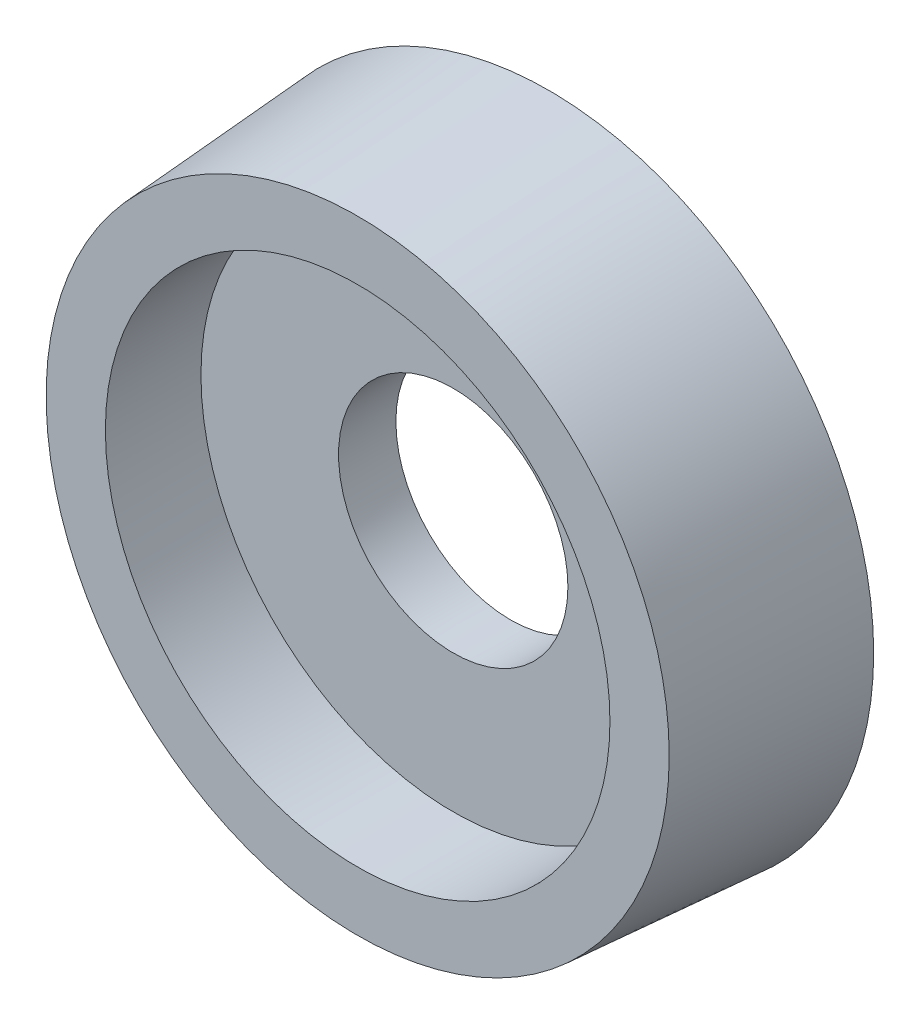
ISO-10303-21;
HEADER;
FILE_DESCRIPTION(('STEP AP214'),'2;1');
FILE_NAME('part.step','',(''),(''),'','','');
FILE_SCHEMA(('AUTOMOTIVE_DESIGN { 1 0 10303 214 1 1 1 1 }'));
ENDSEC;
DATA;
#1=APPLICATION_CONTEXT('core data for automotive mechanical design processes');
#2=APPLICATION_PROTOCOL_DEFINITION('international standard','automotive_design',2000,#1);
#3=PRODUCT_CONTEXT('',#1,'mechanical');
#4=PRODUCT('Part','Part','',(#3));
#5=PRODUCT_RELATED_PRODUCT_CATEGORY('part','',(#4));
#6=PRODUCT_DEFINITION_FORMATION('','',#4);
#7=PRODUCT_DEFINITION_CONTEXT('part definition',#1,'design');
#8=PRODUCT_DEFINITION('design','',#6,#7);
#9=PRODUCT_DEFINITION_SHAPE('','',#8);
#10=(LENGTH_UNIT() NAMED_UNIT(*) SI_UNIT(.MILLI.,.METRE.));
#11=(NAMED_UNIT(*) PLANE_ANGLE_UNIT() SI_UNIT($,.RADIAN.));
#12=(NAMED_UNIT(*) SI_UNIT($,.STERADIAN.) SOLID_ANGLE_UNIT());
#13=UNCERTAINTY_MEASURE_WITH_UNIT(LENGTH_MEASURE(1.E-05),#10,'distance_accuracy_value','');
#14=(GEOMETRIC_REPRESENTATION_CONTEXT(3) GLOBAL_UNCERTAINTY_ASSIGNED_CONTEXT((#13)) GLOBAL_UNIT_ASSIGNED_CONTEXT((#10,
#11,#12)) REPRESENTATION_CONTEXT('',''));
#15=CARTESIAN_POINT('',(0.,0.,0.));
#16=DIRECTION('',(0.,0.,1.));
#17=DIRECTION('',(1.,0.,0.));
#18=AXIS2_PLACEMENT_3D('',#15,#16,#17);
#19=CARTESIAN_POINT('',(0.,0.,0.));
#20=DIRECTION('',(0.,0.,-1.));
#21=DIRECTION('',(1.,0.,0.));
#22=AXIS2_PLACEMENT_3D('',#19,#20,#21);
#23=CONICAL_SURFACE('',#22,8.5,0.0698131700797732);
#24=CARTESIAN_POINT('',(0.,0.,5.));
#25=DIRECTION('',(0.,0.,1.));
#26=DIRECTION('',(1.,0.,0.));
#27=AXIS2_PLACEMENT_3D('',#24,#25,#26);
#28=CIRCLE('',#27,8.15036594028245);
#29=CARTESIAN_POINT('',(8.15036594028245,0.,5.));
#30=VERTEX_POINT('',#29);
#31=EDGE_CURVE('E10',#30,#30,#28,.T.);
#32=ORIENTED_EDGE('',*,*,#31,.F.);
#33=EDGE_LOOP('',(#32));
#34=FACE_BOUND('',#33,.T.);
#35=CARTESIAN_POINT('',(0.,0.,0.));
#36=DIRECTION('',(0.,0.,1.));
#37=DIRECTION('',(1.,0.,0.));
#38=AXIS2_PLACEMENT_3D('',#35,#36,#37);
#39=CIRCLE('',#38,8.5);
#40=CARTESIAN_POINT('',(8.5,0.,0.));
#41=VERTEX_POINT('',#40);
#42=EDGE_CURVE('E45',#41,#41,#39,.T.);
#43=ORIENTED_EDGE('',*,*,#42,.T.);
#44=EDGE_LOOP('',(#43));
#45=FACE_BOUND('',#44,.T.);
#46=ADVANCED_FACE('F37',(#34,#45),#23,.T.);
#47=CARTESIAN_POINT('',(0.,0.,5.));
#48=DIRECTION('',(0.,0.,1.));
#49=DIRECTION('',(1.,0.,0.));
#50=AXIS2_PLACEMENT_3D('',#47,#48,#49);
#51=PLANE('',#50);
#52=CARTESIAN_POINT('',(0.,0.,5.));
#53=DIRECTION('',(0.,0.,1.));
#54=DIRECTION('',(1.,0.,0.));
#55=AXIS2_PLACEMENT_3D('',#52,#53,#54);
#56=CIRCLE('',#55,6.6);
#57=CARTESIAN_POINT('',(6.6,0.,5.));
#58=VERTEX_POINT('',#57);
#59=EDGE_CURVE('E61',#58,#58,#56,.T.);
#60=ORIENTED_EDGE('',*,*,#59,.F.);
#61=EDGE_LOOP('',(#60));
#62=FACE_BOUND('',#61,.T.);
#63=ORIENTED_EDGE('',*,*,#31,.T.);
#64=EDGE_LOOP('',(#63));
#65=FACE_BOUND('',#64,.T.);
#66=ADVANCED_FACE('F92',(#62,#65),#51,.T.);
#67=CARTESIAN_POINT('',(0.,0.,0.));
#68=DIRECTION('',(0.,0.,1.));
#69=DIRECTION('',(1.,0.,0.));
#70=AXIS2_PLACEMENT_3D('',#67,#68,#69);
#71=PLANE('',#70);
#72=CARTESIAN_POINT('',(0.,0.,0.));
#73=DIRECTION('',(0.,0.,-1.));
#74=DIRECTION('',(-1.,0.,0.));
#75=AXIS2_PLACEMENT_3D('',#72,#73,#74);
#76=CIRCLE('',#75,5.);
#77=CARTESIAN_POINT('',(-5.,0.,0.));
#78=VERTEX_POINT('',#77);
#79=EDGE_CURVE('E53',#78,#78,#76,.T.);
#80=ORIENTED_EDGE('',*,*,#79,.F.);
#81=EDGE_LOOP('',(#80));
#82=FACE_BOUND('',#81,.T.);
#83=ORIENTED_EDGE('',*,*,#42,.F.);
#84=EDGE_LOOP('',(#83));
#85=FACE_BOUND('',#84,.T.);
#86=ADVANCED_FACE('F94',(#82,#85),#71,.F.);
#87=CARTESIAN_POINT('',(0.,0.,1.));
#88=DIRECTION('',(0.,0.,-1.));
#89=DIRECTION('',(-1.,0.,0.));
#90=AXIS2_PLACEMENT_3D('',#87,#88,#89);
#91=CYLINDRICAL_SURFACE('',#90,5.);
#92=CARTESIAN_POINT('',(0.,0.,1.));
#93=DIRECTION('',(0.,0.,-1.));
#94=DIRECTION('',(-1.,0.,0.));
#95=AXIS2_PLACEMENT_3D('',#92,#93,#94);
#96=CIRCLE('',#95,5.);
#97=CARTESIAN_POINT('',(-5.,0.,1.));
#98=VERTEX_POINT('',#97);
#99=EDGE_CURVE('E50',#98,#98,#96,.T.);
#100=ORIENTED_EDGE('',*,*,#99,.F.);
#101=EDGE_LOOP('',(#100));
#102=FACE_BOUND('',#101,.T.);
#103=ORIENTED_EDGE('',*,*,#79,.T.);
#104=EDGE_LOOP('',(#103));
#105=FACE_BOUND('',#104,.T.);
#106=ADVANCED_FACE('F100',(#102,#105),#91,.F.);
#107=CARTESIAN_POINT('',(0.,0.,1.));
#108=DIRECTION('',(0.,0.,-1.));
#109=DIRECTION('',(-1.,0.,0.));
#110=AXIS2_PLACEMENT_3D('',#107,#108,#109);
#111=PLANE('',#110);
#112=CARTESIAN_POINT('',(0.,0.,1.));
#113=DIRECTION('',(0.,0.,-1.));
#114=DIRECTION('',(-1.,0.,0.));
#115=AXIS2_PLACEMENT_3D('',#112,#113,#114);
#116=CIRCLE('',#115,3.);
#117=CARTESIAN_POINT('',(-3.,0.,1.));
#118=VERTEX_POINT('',#117);
#119=EDGE_CURVE('E65',#118,#118,#116,.T.);
#120=ORIENTED_EDGE('',*,*,#119,.F.);
#121=EDGE_LOOP('',(#120));
#122=FACE_BOUND('',#121,.T.);
#123=ORIENTED_EDGE('',*,*,#99,.T.);
#124=EDGE_LOOP('',(#123));
#125=FACE_BOUND('',#124,.T.);
#126=ADVANCED_FACE('F88',(#122,#125),#111,.T.);
#127=CARTESIAN_POINT('',(0.,0.,2.5));
#128=DIRECTION('',(0.,0.,1.));
#129=DIRECTION('',(1.,0.,0.));
#130=AXIS2_PLACEMENT_3D('',#127,#128,#129);
#131=CYLINDRICAL_SURFACE('',#130,6.6);
#132=CARTESIAN_POINT('',(0.,0.,2.5));
#133=DIRECTION('',(0.,0.,1.));
#134=DIRECTION('',(1.,0.,0.));
#135=AXIS2_PLACEMENT_3D('',#132,#133,#134);
#136=CIRCLE('',#135,6.6);
#137=CARTESIAN_POINT('',(6.6,0.,2.5));
#138=VERTEX_POINT('',#137);
#139=EDGE_CURVE('E57',#138,#138,#136,.T.);
#140=ORIENTED_EDGE('',*,*,#139,.F.);
#141=EDGE_LOOP('',(#140));
#142=FACE_BOUND('',#141,.T.);
#143=ORIENTED_EDGE('',*,*,#59,.T.);
#144=EDGE_LOOP('',(#143));
#145=FACE_BOUND('',#144,.T.);
#146=ADVANCED_FACE('F82',(#142,#145),#131,.F.);
#147=CARTESIAN_POINT('',(0.,0.,2.5));
#148=DIRECTION('',(0.,0.,1.));
#149=DIRECTION('',(1.,0.,0.));
#150=AXIS2_PLACEMENT_3D('',#147,#148,#149);
#151=PLANE('',#150);
#152=CARTESIAN_POINT('',(0.,0.,2.5));
#153=DIRECTION('',(0.,0.,1.));
#154=DIRECTION('',(1.,0.,0.));
#155=AXIS2_PLACEMENT_3D('',#152,#153,#154);
#156=CIRCLE('',#155,3.);
#157=CARTESIAN_POINT('',(3.,0.,2.5));
#158=VERTEX_POINT('',#157);
#159=EDGE_CURVE('E40',#158,#158,#156,.T.);
#160=ORIENTED_EDGE('',*,*,#159,.F.);
#161=EDGE_LOOP('',(#160));
#162=FACE_BOUND('',#161,.T.);
#163=ORIENTED_EDGE('',*,*,#139,.T.);
#164=EDGE_LOOP('',(#163));
#165=FACE_BOUND('',#164,.T.);
#166=ADVANCED_FACE('F79',(#162,#165),#151,.T.);
#167=CARTESIAN_POINT('',(0.,0.,0.));
#168=DIRECTION('',(0.,0.,1.));
#169=DIRECTION('',(1.,0.,0.));
#170=AXIS2_PLACEMENT_3D('',#167,#168,#169);
#171=CYLINDRICAL_SURFACE('',#170,3.);
#172=ORIENTED_EDGE('',*,*,#119,.T.);
#173=EDGE_LOOP('',(#172));
#174=FACE_BOUND('',#173,.T.);
#175=ORIENTED_EDGE('',*,*,#159,.T.);
#176=EDGE_LOOP('',(#175));
#177=FACE_BOUND('',#176,.T.);
#178=ADVANCED_FACE('F77',(#174,#177),#171,.F.);
#179=CLOSED_SHELL('',(#46,#66,#86,#106,#126,#146,#166,#178));
#180=MANIFOLD_SOLID_BREP('B2',#179);
#181=ADVANCED_BREP_SHAPE_REPRESENTATION('',(#18,#180),#14);
#182=SHAPE_DEFINITION_REPRESENTATION(#9,#181);
ENDSEC;
END-ISO-10303-21;
